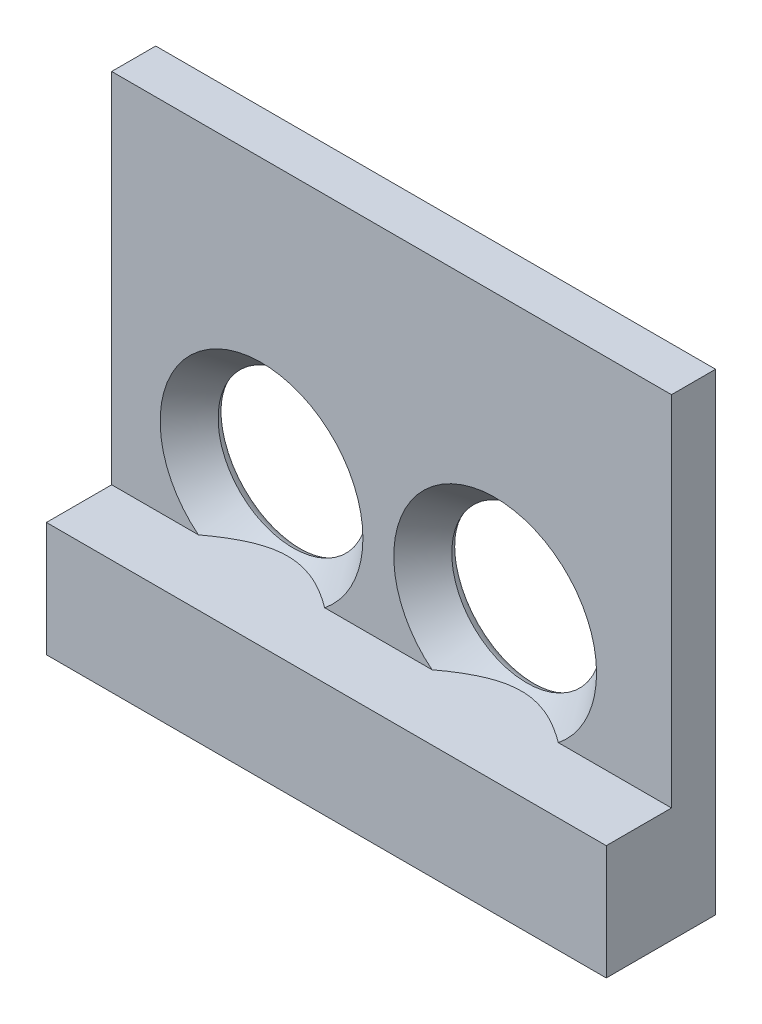
ISO-10303-21;
HEADER;
FILE_DESCRIPTION(('STEP AP214'),'2;1');
FILE_NAME('part.step','',(''),(''),'','','');
FILE_SCHEMA(('AUTOMOTIVE_DESIGN { 1 0 10303 214 1 1 1 1 }'));
ENDSEC;
DATA;
#1=APPLICATION_CONTEXT('core data for automotive mechanical design processes');
#2=APPLICATION_PROTOCOL_DEFINITION('international standard','automotive_design',2000,#1);
#3=PRODUCT_CONTEXT('',#1,'mechanical');
#4=PRODUCT('Part','Part','',(#3));
#5=PRODUCT_RELATED_PRODUCT_CATEGORY('part','',(#4));
#6=PRODUCT_DEFINITION_FORMATION('','',#4);
#7=PRODUCT_DEFINITION_CONTEXT('part definition',#1,'design');
#8=PRODUCT_DEFINITION('design','',#6,#7);
#9=PRODUCT_DEFINITION_SHAPE('','',#8);
#10=(LENGTH_UNIT() NAMED_UNIT(*) SI_UNIT(.MILLI.,.METRE.));
#11=(NAMED_UNIT(*) PLANE_ANGLE_UNIT() SI_UNIT($,.RADIAN.));
#12=(NAMED_UNIT(*) SI_UNIT($,.STERADIAN.) SOLID_ANGLE_UNIT());
#13=UNCERTAINTY_MEASURE_WITH_UNIT(LENGTH_MEASURE(1.E-05),#10,'distance_accuracy_value','');
#14=(GEOMETRIC_REPRESENTATION_CONTEXT(3) GLOBAL_UNCERTAINTY_ASSIGNED_CONTEXT((#13)) GLOBAL_UNIT_ASSIGNED_CONTEXT((#10,
#11,#12)) REPRESENTATION_CONTEXT('',''));
#15=CARTESIAN_POINT('',(0.,0.,0.));
#16=DIRECTION('',(0.,0.,1.));
#17=DIRECTION('',(1.,0.,0.));
#18=AXIS2_PLACEMENT_3D('',#15,#16,#17);
#19=CARTESIAN_POINT('',(-25.538243936064,62.13133386161,5.));
#20=DIRECTION('',(1.,0.,0.));
#21=DIRECTION('',(0.,0.,-1.));
#22=AXIS2_PLACEMENT_3D('',#19,#20,#21);
#23=PLANE('',#22);
#24=DIRECTION('',(0.,-1.,0.));
#25=VECTOR('',#24,1.);
#26=CARTESIAN_POINT('',(-25.538243936064,62.13133386161,0.));
#27=LINE('',#26,#25);
#28=CARTESIAN_POINT('',(-25.538243936064,62.13133386161,0.));
#29=VERTEX_POINT('',#28);
#30=CARTESIAN_POINT('',(-25.538243936064,8.53133386160998,0.));
#31=VERTEX_POINT('',#30);
#32=EDGE_CURVE('E112',#29,#31,#27,.T.);
#33=ORIENTED_EDGE('',*,*,#32,.T.);
#34=DIRECTION('',(0.,0.,-1.));
#35=VECTOR('',#34,1.);
#36=CARTESIAN_POINT('',(-25.538243936064,8.53133386160998,5.));
#37=LINE('',#36,#35);
#38=CARTESIAN_POINT('',(-25.538243936064,8.53133386160998,12.4));
#39=VERTEX_POINT('',#38);
#40=EDGE_CURVE('E105',#39,#31,#37,.T.);
#41=ORIENTED_EDGE('',*,*,#40,.F.);
#42=DIRECTION('',(0.,-1.,0.));
#43=VECTOR('',#42,1.);
#44=CARTESIAN_POINT('',(-25.538243936064,8.53133386160998,12.4));
#45=LINE('',#44,#43);
#46=CARTESIAN_POINT('',(-25.538243936064,21.53133386161,12.4));
#47=VERTEX_POINT('',#46);
#48=EDGE_CURVE('E109',#47,#39,#45,.T.);
#49=ORIENTED_EDGE('',*,*,#48,.F.);
#50=DIRECTION('',(0.,0.,-1.));
#51=VECTOR('',#50,1.);
#52=CARTESIAN_POINT('',(-25.538243936064,21.53133386161,12.4));
#53=LINE('',#52,#51);
#54=CARTESIAN_POINT('',(-25.538243936064,21.53133386161,5.));
#55=VERTEX_POINT('',#54);
#56=EDGE_CURVE('E143',#47,#55,#53,.T.);
#57=ORIENTED_EDGE('',*,*,#56,.T.);
#58=DIRECTION('',(0.,-1.,0.));
#59=VECTOR('',#58,1.);
#60=CARTESIAN_POINT('',(-25.538243936064,62.13133386161,5.));
#61=LINE('',#60,#59);
#62=CARTESIAN_POINT('',(-25.538243936064,62.13133386161,5.));
#63=VERTEX_POINT('',#62);
#64=EDGE_CURVE('E151',#63,#55,#61,.T.);
#65=ORIENTED_EDGE('',*,*,#64,.F.);
#66=DIRECTION('',(0.,0.,-1.));
#67=VECTOR('',#66,1.);
#68=CARTESIAN_POINT('',(-25.538243936064,62.13133386161,5.));
#69=LINE('',#68,#67);
#70=EDGE_CURVE('E162',#63,#29,#69,.T.);
#71=ORIENTED_EDGE('',*,*,#70,.T.);
#72=EDGE_LOOP('',(#33,#41,#49,#57,#65,#71));
#73=FACE_BOUND('',#72,.T.);
#74=ADVANCED_FACE('F39',(#73),#23,.F.);
#75=CARTESIAN_POINT('',(-25.538243936064,8.53133386160998,5.));
#76=DIRECTION('',(0.,1.,0.));
#77=DIRECTION('',(0.,0.,1.));
#78=AXIS2_PLACEMENT_3D('',#75,#76,#77);
#79=PLANE('',#78);
#80=DIRECTION('',(1.,0.,0.));
#81=VECTOR('',#80,1.);
#82=CARTESIAN_POINT('',(-25.538243936064,8.53133386160998,0.));
#83=LINE('',#82,#81);
#84=CARTESIAN_POINT('',(37.961756063936,8.53133386160998,0.));
#85=VERTEX_POINT('',#84);
#86=EDGE_CURVE('E165',#31,#85,#83,.T.);
#87=ORIENTED_EDGE('',*,*,#86,.T.);
#88=DIRECTION('',(0.,0.,-1.));
#89=VECTOR('',#88,1.);
#90=CARTESIAN_POINT('',(37.961756063936,8.53133386160998,5.));
#91=LINE('',#90,#89);
#92=CARTESIAN_POINT('',(37.961756063936,8.53133386160998,12.4));
#93=VERTEX_POINT('',#92);
#94=EDGE_CURVE('E116',#93,#85,#91,.T.);
#95=ORIENTED_EDGE('',*,*,#94,.F.);
#96=DIRECTION('',(1.,0.,0.));
#97=VECTOR('',#96,1.);
#98=CARTESIAN_POINT('',(-25.538243936064,8.53133386160998,12.4));
#99=LINE('',#98,#97);
#100=EDGE_CURVE('E119',#39,#93,#99,.T.);
#101=ORIENTED_EDGE('',*,*,#100,.F.);
#102=ORIENTED_EDGE('',*,*,#40,.T.);
#103=EDGE_LOOP('',(#87,#95,#101,#102));
#104=FACE_BOUND('',#103,.T.);
#105=ADVANCED_FACE('F120',(#104),#79,.F.);
#106=CARTESIAN_POINT('',(37.961756063936,62.13133386161,5.));
#107=DIRECTION('',(-1.,0.,0.));
#108=DIRECTION('',(0.,-1.,0.));
#109=AXIS2_PLACEMENT_3D('',#106,#107,#108);
#110=PLANE('',#109);
#111=DIRECTION('',(0.,1.,0.));
#112=VECTOR('',#111,1.);
#113=CARTESIAN_POINT('',(37.961756063936,62.13133386161,0.));
#114=LINE('',#113,#112);
#115=CARTESIAN_POINT('',(37.961756063936,62.13133386161,0.));
#116=VERTEX_POINT('',#115);
#117=EDGE_CURVE('E168',#85,#116,#114,.T.);
#118=ORIENTED_EDGE('',*,*,#117,.T.);
#119=DIRECTION('',(0.,0.,-1.));
#120=VECTOR('',#119,1.);
#121=CARTESIAN_POINT('',(37.961756063936,62.13133386161,5.));
#122=LINE('',#121,#120);
#123=CARTESIAN_POINT('',(37.961756063936,62.13133386161,5.));
#124=VERTEX_POINT('',#123);
#125=EDGE_CURVE('E175',#124,#116,#122,.T.);
#126=ORIENTED_EDGE('',*,*,#125,.F.);
#127=DIRECTION('',(0.,1.,0.));
#128=VECTOR('',#127,1.);
#129=CARTESIAN_POINT('',(37.961756063936,62.13133386161,5.));
#130=LINE('',#129,#128);
#131=CARTESIAN_POINT('',(37.961756063936,21.53133386161,5.));
#132=VERTEX_POINT('',#131);
#133=EDGE_CURVE('E155',#132,#124,#130,.T.);
#134=ORIENTED_EDGE('',*,*,#133,.F.);
#135=DIRECTION('',(0.,0.,-1.));
#136=VECTOR('',#135,1.);
#137=CARTESIAN_POINT('',(37.961756063936,21.53133386161,12.4));
#138=LINE('',#137,#136);
#139=CARTESIAN_POINT('',(37.961756063936,21.53133386161,12.4));
#140=VERTEX_POINT('',#139);
#141=EDGE_CURVE('E147',#140,#132,#138,.T.);
#142=ORIENTED_EDGE('',*,*,#141,.F.);
#143=DIRECTION('',(0.,1.,0.));
#144=VECTOR('',#143,1.);
#145=CARTESIAN_POINT('',(37.961756063936,8.53133386160998,12.4));
#146=LINE('',#145,#144);
#147=EDGE_CURVE('E125',#93,#140,#146,.T.);
#148=ORIENTED_EDGE('',*,*,#147,.F.);
#149=ORIENTED_EDGE('',*,*,#94,.T.);
#150=EDGE_LOOP('',(#118,#126,#134,#142,#148,#149));
#151=FACE_BOUND('',#150,.T.);
#152=ADVANCED_FACE('F235',(#151),#110,.F.);
#153=CARTESIAN_POINT('',(-25.538243936064,62.13133386161,5.));
#154=DIRECTION('',(0.,-1.,0.));
#155=DIRECTION('',(0.,0.,-1.));
#156=AXIS2_PLACEMENT_3D('',#153,#154,#155);
#157=PLANE('',#156);
#158=DIRECTION('',(-1.,0.,0.));
#159=VECTOR('',#158,1.);
#160=CARTESIAN_POINT('',(-25.538243936064,62.13133386161,0.));
#161=LINE('',#160,#159);
#162=EDGE_CURVE('E156',#116,#29,#161,.T.);
#163=ORIENTED_EDGE('',*,*,#162,.T.);
#164=ORIENTED_EDGE('',*,*,#70,.F.);
#165=DIRECTION('',(-1.,0.,0.));
#166=VECTOR('',#165,1.);
#167=CARTESIAN_POINT('',(-25.538243936064,62.13133386161,5.));
#168=LINE('',#167,#166);
#169=EDGE_CURVE('E159',#124,#63,#168,.T.);
#170=ORIENTED_EDGE('',*,*,#169,.F.);
#171=ORIENTED_EDGE('',*,*,#125,.T.);
#172=EDGE_LOOP('',(#163,#164,#170,#171));
#173=FACE_BOUND('',#172,.T.);
#174=ADVANCED_FACE('F239',(#173),#157,.F.);
#175=CARTESIAN_POINT('',(0.,0.,5.));
#176=DIRECTION('',(0.,0.,1.));
#177=DIRECTION('',(1.,0.,0.));
#178=AXIS2_PLACEMENT_3D('',#175,#176,#177);
#179=PLANE('',#178);
#180=DIRECTION('',(-1.,0.,0.));
#181=VECTOR('',#180,1.);
#182=CARTESIAN_POINT('',(-25.538243936064,21.53133386161,5.));
#183=LINE('',#182,#181);
#184=CARTESIAN_POINT('',(10.8028455322979,21.53133386161,5.));
#185=VERTEX_POINT('',#184);
#186=CARTESIAN_POINT('',(-1.37933340442584,21.53133386161,5.));
#187=VERTEX_POINT('',#186);
#188=EDGE_CURVE('E136',#185,#187,#183,.T.);
#189=ORIENTED_EDGE('',*,*,#188,.F.);
#190=CARTESIAN_POINT('',(17.961756063936,30.53133386161,5.));
#191=DIRECTION('',(0.,0.,1.));
#192=DIRECTION('',(1.,0.,0.));
#193=AXIS2_PLACEMENT_3D('',#190,#191,#192);
#194=CIRCLE('',#193,11.5);
#195=CARTESIAN_POINT('',(25.1206665955742,21.53133386161,5.));
#196=VERTEX_POINT('',#195);
#197=EDGE_CURVE('E187',#185,#196,#194,.F.);
#198=ORIENTED_EDGE('',*,*,#197,.T.);
#199=EDGE_CURVE('E132',#132,#196,#183,.T.);
#200=ORIENTED_EDGE('',*,*,#199,.F.);
#201=ORIENTED_EDGE('',*,*,#133,.T.);
#202=ORIENTED_EDGE('',*,*,#169,.T.);
#203=ORIENTED_EDGE('',*,*,#64,.T.);
#204=CARTESIAN_POINT('',(-15.6971544677021,21.53133386161,5.));
#205=VERTEX_POINT('',#204);
#206=EDGE_CURVE('E138',#205,#55,#183,.T.);
#207=ORIENTED_EDGE('',*,*,#206,.F.);
#208=CARTESIAN_POINT('',(-8.53824393606398,30.53133386161,5.));
#209=DIRECTION('',(0.,0.,1.));
#210=DIRECTION('',(1.,0.,0.));
#211=AXIS2_PLACEMENT_3D('',#208,#209,#210);
#212=CIRCLE('',#211,11.5);
#213=EDGE_CURVE('E184',#205,#187,#212,.F.);
#214=ORIENTED_EDGE('',*,*,#213,.T.);
#215=EDGE_LOOP('',(#189,#198,#200,#201,#202,#203,#207,#214));
#216=FACE_BOUND('',#215,.T.);
#217=ADVANCED_FACE('F245',(#216),#179,.T.);
#218=CARTESIAN_POINT('',(0.,0.,0.));
#219=DIRECTION('',(0.,0.,1.));
#220=DIRECTION('',(1.,0.,0.));
#221=AXIS2_PLACEMENT_3D('',#218,#219,#220);
#222=PLANE('',#221);
#223=CARTESIAN_POINT('',(17.961756063936,30.53133386161,0.));
#224=DIRECTION('',(0.,0.,1.));
#225=DIRECTION('',(1.,0.,0.));
#226=AXIS2_PLACEMENT_3D('',#223,#224,#225);
#227=CIRCLE('',#226,10.4154829776182);
#228=CARTESIAN_POINT('',(28.3772390415542,30.53133386161,0.));
#229=VERTEX_POINT('',#228);
#230=EDGE_CURVE('E11',#229,#229,#227,.T.);
#231=ORIENTED_EDGE('',*,*,#230,.T.);
#232=EDGE_LOOP('',(#231));
#233=FACE_BOUND('',#232,.T.);
#234=CARTESIAN_POINT('',(-8.53824393606398,30.53133386161,0.));
#235=DIRECTION('',(0.,0.,1.));
#236=DIRECTION('',(1.,0.,0.));
#237=AXIS2_PLACEMENT_3D('',#234,#235,#236);
#238=CIRCLE('',#237,10.4154829776182);
#239=CARTESIAN_POINT('',(1.87723904155418,30.53133386161,0.));
#240=VERTEX_POINT('',#239);
#241=EDGE_CURVE('E48',#240,#240,#238,.T.);
#242=ORIENTED_EDGE('',*,*,#241,.T.);
#243=EDGE_LOOP('',(#242));
#244=FACE_BOUND('',#243,.T.);
#245=ORIENTED_EDGE('',*,*,#32,.F.);
#246=ORIENTED_EDGE('',*,*,#162,.F.);
#247=ORIENTED_EDGE('',*,*,#117,.F.);
#248=ORIENTED_EDGE('',*,*,#86,.F.);
#249=EDGE_LOOP('',(#245,#246,#247,#248));
#250=FACE_BOUND('',#249,.T.);
#251=ADVANCED_FACE('F247',(#233,#244,#250),#222,.F.);
#252=CARTESIAN_POINT('',(-25.538243936064,21.53133386161,12.4));
#253=DIRECTION('',(0.,-1.,0.));
#254=DIRECTION('',(0.,0.,-1.));
#255=AXIS2_PLACEMENT_3D('',#252,#253,#254);
#256=PLANE('',#255);
#257=ORIENTED_EDGE('',*,*,#199,.T.);
#258=CARTESIAN_POINT('',(25.1206665955742,21.53133386161,5.));
#259=CARTESIAN_POINT('',(24.9707884558801,21.53133386161,4.88882127975553));
#260=CARTESIAN_POINT('',(24.8198922272615,21.53133386161,4.77899973271482));
#261=CARTESIAN_POINT('',(24.5158322500172,21.53133386161,4.56248165085394));
#262=CARTESIAN_POINT('',(24.3626680694144,21.53133386161,4.45578572320402));
#263=CARTESIAN_POINT('',(24.0533443449843,21.53133386161,4.24559620917078));
#264=CARTESIAN_POINT('',(23.8971760223859,21.53133386161,4.14211549307026));
#265=CARTESIAN_POINT('',(23.5821790242611,21.53133386161,3.93931180903068));
#266=CARTESIAN_POINT('',(23.4233504834086,21.53133386161,3.83998863150109));
#267=CARTESIAN_POINT('',(22.9340578747123,21.53133386161,3.54402112276973));
#268=CARTESIAN_POINT('',(22.5989121651274,21.53133386161,3.35498687561698));
#269=CARTESIAN_POINT('',(21.9150544007936,21.53133386161,3.00399323737214));
#270=CARTESIAN_POINT('',(21.5663626473338,21.53133386161,2.84199512123846));
#271=CARTESIAN_POINT('',(20.9907341205922,21.53133386161,2.60909470810025));
#272=CARTESIAN_POINT('',(20.7683057070496,21.53133386161,2.52706407307454));
#273=CARTESIAN_POINT('',(20.3180737567671,21.53133386161,2.37913042208977));
#274=CARTESIAN_POINT('',(20.0902700455131,21.53133386161,2.31322793053788));
#275=CARTESIAN_POINT('',(19.6320338257532,21.53133386161,2.20052151306516));
#276=CARTESIAN_POINT('',(19.4016413655192,21.53133386161,2.15355659410367));
#277=CARTESIAN_POINT('',(18.9376033787743,21.53133386161,2.08000196855281));
#278=CARTESIAN_POINT('',(18.7039581533172,21.53133386161,2.05341038894386));
#279=CARTESIAN_POINT('',(18.2329021818288,21.53133386161,2.02178853002527));
#280=CARTESIAN_POINT('',(17.9954769254906,21.53133386161,2.01697079455265));
#281=CARTESIAN_POINT('',(17.5212373597953,21.53133386161,2.0297387856078));
#282=CARTESIAN_POINT('',(17.2844230588214,21.53133386161,2.04732481793491));
#283=CARTESIAN_POINT('',(16.8126018653836,21.53133386161,2.10406203721945));
#284=CARTESIAN_POINT('',(16.5776039587433,21.53133386161,2.14328698773307));
#285=CARTESIAN_POINT('',(16.1117941176042,21.53133386161,2.24144865585203));
#286=CARTESIAN_POINT('',(15.8809828306012,21.53133386161,2.30038839556826));
#287=CARTESIAN_POINT('',(15.3266765699851,21.53133386161,2.46455331966611));
#288=CARTESIAN_POINT('',(15.0058537080853,21.53133386161,2.57878946549646));
#289=CARTESIAN_POINT('',(14.3756402256905,21.53133386161,2.83530841571852));
#290=CARTESIAN_POINT('',(14.0662576454559,21.53133386161,2.9776105162022));
#291=CARTESIAN_POINT('',(13.4576787997359,21.53133386161,3.28428151306857));
#292=CARTESIAN_POINT('',(13.1585133850745,21.53133386161,3.44871090872444));
#293=CARTESIAN_POINT('',(12.5701940134251,21.53133386161,3.7942466907046));
#294=CARTESIAN_POINT('',(12.2810370015767,21.53133386161,3.97534792541007));
#295=CARTESIAN_POINT('',(11.7926508790697,21.53133386161,4.29691977837478));
#296=CARTESIAN_POINT('',(11.5913176469096,21.53133386161,4.43422796733436));
#297=CARTESIAN_POINT('',(11.1937176586034,21.53133386161,4.71362396914593));
#298=CARTESIAN_POINT('',(10.9974284137376,21.53133386161,4.8556797292035));
#299=CARTESIAN_POINT('',(10.8028455322979,21.53133386161,5.));
#300=B_SPLINE_CURVE_WITH_KNOTS('',3,(#258,#259,#260,#261,#262,#263,#264,#265,#266,#267,#268,
#269,#270,#271,#272,#273,#274,#275,#276,#277,#278,#279,#280,#281,#282,#283,#284,#285,#286,#287,
#288,#289,#290,#291,#292,#293,#294,#295,#296,#297,#298,#299),.UNSPECIFIED.,.F.,.F.,(4,2,2,2,2,2,
2,2,2,2,2,2,2,2,2,2,2,2,2,2,4),(0.,0.559842224133377,1.1197924893571,1.68175280245573,
2.24368475171273,3.3971241235555,4.54889692408191,5.25960991303315,5.97034600777405,
6.67490567899228,7.37940056885867,8.09075768861675,8.80212451811973,9.51593140132147,
10.2298477552821,11.2497267797404,12.270309458024,13.2937415101402,14.3168583752408,
15.0478613051424,15.774657496133),.UNSPECIFIED.);
#301=EDGE_CURVE('E195',#196,#185,#300,.T.);
#302=ORIENTED_EDGE('',*,*,#301,.T.);
#303=ORIENTED_EDGE('',*,*,#188,.T.);
#304=CARTESIAN_POINT('',(-1.37933340442584,21.53133386161,5.));
#305=CARTESIAN_POINT('',(-1.52921154411988,21.53133386161,4.88882127975553));
#306=CARTESIAN_POINT('',(-1.68010777273856,21.53133386161,4.77899973271482));
#307=CARTESIAN_POINT('',(-1.9841677499828,21.53133386161,4.56248165085394));
#308=CARTESIAN_POINT('',(-2.1373319305856,21.53133386161,4.45578572320402));
#309=CARTESIAN_POINT('',(-2.44665565501574,21.53133386161,4.24559620917078));
#310=CARTESIAN_POINT('',(-2.60282397761415,21.53133386161,4.14211549307026));
#311=CARTESIAN_POINT('',(-2.91782097573896,21.53133386161,3.93931180903068));
#312=CARTESIAN_POINT('',(-3.07664951659144,21.53133386161,3.83998863150109));
#313=CARTESIAN_POINT('',(-3.56594212528774,21.53133386161,3.54402112276973));
#314=CARTESIAN_POINT('',(-3.90108783487262,21.53133386161,3.35498687561698));
#315=CARTESIAN_POINT('',(-4.58494559920644,21.53133386161,3.00399323737214));
#316=CARTESIAN_POINT('',(-4.93363735266627,21.53133386161,2.84199512123846));
#317=CARTESIAN_POINT('',(-5.50926587940786,21.53133386161,2.60909470810025));
#318=CARTESIAN_POINT('',(-5.73169429295037,21.53133386161,2.52706407307454));
#319=CARTESIAN_POINT('',(-6.18192624323292,21.53133386161,2.37913042208977));
#320=CARTESIAN_POINT('',(-6.40972995448697,21.53133386161,2.31322793053788));
#321=CARTESIAN_POINT('',(-6.86796617424684,21.53133386161,2.20052151306516));
#322=CARTESIAN_POINT('',(-7.09835863448081,21.53133386161,2.15355659410367));
#323=CARTESIAN_POINT('',(-7.5623966212257,21.53133386161,2.08000196855281));
#324=CARTESIAN_POINT('',(-7.79604184668286,21.53133386161,2.05341038894386));
#325=CARTESIAN_POINT('',(-8.26709781817126,21.53133386161,2.02178853002527));
#326=CARTESIAN_POINT('',(-8.50452307450937,21.53133386161,2.01697079455265));
#327=CARTESIAN_POINT('',(-8.97876264020474,21.53133386161,2.0297387856078));
#328=CARTESIAN_POINT('',(-9.21557694117857,21.53133386161,2.04732481793491));
#329=CARTESIAN_POINT('',(-9.68739813461639,21.53133386161,2.10406203721945));
#330=CARTESIAN_POINT('',(-9.92239604125673,21.53133386161,2.14328698773307));
#331=CARTESIAN_POINT('',(-10.3882058823958,21.53133386161,2.24144865585203));
#332=CARTESIAN_POINT('',(-10.6190171693988,21.53133386161,2.30038839556826));
#333=CARTESIAN_POINT('',(-11.173323430015,21.53133386161,2.46455331966611));
#334=CARTESIAN_POINT('',(-11.4941462919148,21.53133386161,2.57878946549646));
#335=CARTESIAN_POINT('',(-12.1243597743095,21.53133386161,2.83530841571852));
#336=CARTESIAN_POINT('',(-12.4337423545442,21.53133386161,2.9776105162022));
#337=CARTESIAN_POINT('',(-13.0423212002642,21.53133386161,3.28428151306857));
#338=CARTESIAN_POINT('',(-13.3414866149255,21.53133386161,3.44871090872444));
#339=CARTESIAN_POINT('',(-13.9298059865749,21.53133386161,3.7942466907046));
#340=CARTESIAN_POINT('',(-14.2189629984233,21.53133386161,3.97534792541007));
#341=CARTESIAN_POINT('',(-14.7073491209303,21.53133386161,4.29691977837478));
#342=CARTESIAN_POINT('',(-14.9086823530905,21.53133386161,4.43422796733436));
#343=CARTESIAN_POINT('',(-15.3062823413966,21.53133386161,4.71362396914593));
#344=CARTESIAN_POINT('',(-15.5025715862624,21.53133386161,4.85567972920351));
#345=CARTESIAN_POINT('',(-15.6971544677021,21.53133386161,5.));
#346=B_SPLINE_CURVE_WITH_KNOTS('',3,(#304,#305,#306,#307,#308,#309,#310,#311,#312,#313,#314,
#315,#316,#317,#318,#319,#320,#321,#322,#323,#324,#325,#326,#327,#328,#329,#330,#331,#332,#333,
#334,#335,#336,#337,#338,#339,#340,#341,#342,#343,#344,#345),.UNSPECIFIED.,.F.,.F.,(4,2,2,2,2,2,
2,2,2,2,2,2,2,2,2,2,2,2,2,2,4),(0.,0.559842224133377,1.1197924893571,1.68175280245573,
2.24368475171272,3.39712412355549,4.5488969240819,5.25960991303315,5.97034600777405,
6.67490567899227,7.37940056885867,8.09075768861675,8.80212451811973,9.51593140132146,
10.2298477552821,11.2497267797404,12.270309458024,13.2937415101402,14.3168583752408,
15.0478613051424,15.774657496133),.UNSPECIFIED.);
#347=EDGE_CURVE('E55',#187,#205,#346,.T.);
#348=ORIENTED_EDGE('',*,*,#347,.T.);
#349=ORIENTED_EDGE('',*,*,#206,.T.);
#350=ORIENTED_EDGE('',*,*,#56,.F.);
#351=DIRECTION('',(-1.,0.,0.));
#352=VECTOR('',#351,1.);
#353=CARTESIAN_POINT('',(-25.538243936064,21.53133386161,12.4));
#354=LINE('',#353,#352);
#355=EDGE_CURVE('E129',#140,#47,#354,.T.);
#356=ORIENTED_EDGE('',*,*,#355,.F.);
#357=ORIENTED_EDGE('',*,*,#141,.T.);
#358=EDGE_LOOP('',(#257,#302,#303,#348,#349,#350,#356,#357));
#359=FACE_BOUND('',#358,.T.);
#360=ADVANCED_FACE('F209',(#359),#256,.F.);
#361=CARTESIAN_POINT('',(0.,0.,12.4));
#362=DIRECTION('',(0.,0.,-1.));
#363=DIRECTION('',(-1.,0.,0.));
#364=AXIS2_PLACEMENT_3D('',#361,#362,#363);
#365=PLANE('',#364);
#366=ORIENTED_EDGE('',*,*,#48,.T.);
#367=ORIENTED_EDGE('',*,*,#100,.T.);
#368=ORIENTED_EDGE('',*,*,#147,.T.);
#369=ORIENTED_EDGE('',*,*,#355,.T.);
#370=EDGE_LOOP('',(#366,#367,#368,#369));
#371=FACE_BOUND('',#370,.T.);
#372=ADVANCED_FACE('F127',(#371),#365,.F.);
#373=CARTESIAN_POINT('',(17.961756063936,30.53133386161,1.42473922221738));
#374=DIRECTION('',(0.,0.,1.));
#375=DIRECTION('',(1.,0.,0.));
#376=AXIS2_PLACEMENT_3D('',#373,#374,#375);
#377=CONICAL_SURFACE('',#376,8.49999999999999,0.698131700797731);
#378=ORIENTED_EDGE('',*,*,#301,.F.);
#379=ORIENTED_EDGE('',*,*,#197,.F.);
#380=EDGE_LOOP('',(#378,#379));
#381=FACE_BOUND('',#380,.T.);
#382=CARTESIAN_POINT('',(17.961756063936,30.53133386161,1.42473922221738));
#383=DIRECTION('',(0.,0.,1.));
#384=DIRECTION('',(1.,0.,0.));
#385=AXIS2_PLACEMENT_3D('',#382,#383,#384);
#386=CIRCLE('',#385,8.49999999999999);
#387=CARTESIAN_POINT('',(26.461756063936,30.53133386161,1.42473922221738));
#388=VERTEX_POINT('',#387);
#389=EDGE_CURVE('E115',#388,#388,#386,.T.);
#390=ORIENTED_EDGE('',*,*,#389,.F.);
#391=EDGE_LOOP('',(#390));
#392=FACE_BOUND('',#391,.T.);
#393=ADVANCED_FACE('F213',(#381,#392),#377,.F.);
#394=CARTESIAN_POINT('',(-8.53824393606398,30.53133386161,1.42473922221738));
#395=DIRECTION('',(0.,0.,1.));
#396=DIRECTION('',(1.,0.,0.));
#397=AXIS2_PLACEMENT_3D('',#394,#395,#396);
#398=CONICAL_SURFACE('',#397,8.49999999999999,0.698131700797731);
#399=ORIENTED_EDGE('',*,*,#347,.F.);
#400=ORIENTED_EDGE('',*,*,#213,.F.);
#401=EDGE_LOOP('',(#399,#400));
#402=FACE_BOUND('',#401,.T.);
#403=CARTESIAN_POINT('',(-8.53824393606398,30.53133386161,1.42473922221738));
#404=DIRECTION('',(0.,0.,1.));
#405=DIRECTION('',(1.,0.,0.));
#406=AXIS2_PLACEMENT_3D('',#403,#404,#405);
#407=CIRCLE('',#406,8.49999999999999);
#408=CARTESIAN_POINT('',(-0.0382439360639853,30.53133386161,1.42473922221738));
#409=VERTEX_POINT('',#408);
#410=EDGE_CURVE('E191',#409,#409,#407,.T.);
#411=ORIENTED_EDGE('',*,*,#410,.F.);
#412=EDGE_LOOP('',(#411));
#413=FACE_BOUND('',#412,.T.);
#414=ADVANCED_FACE('F217',(#402,#413),#398,.F.);
#415=CARTESIAN_POINT('',(17.961756063936,30.53133386161,2.));
#416=DIRECTION('',(0.,0.,1.));
#417=DIRECTION('',(1.,0.,0.));
#418=AXIS2_PLACEMENT_3D('',#415,#416,#417);
#419=TOROIDAL_SURFACE('',#418,10.4154829776182,2.);
#420=ORIENTED_EDGE('',*,*,#230,.F.);
#421=EDGE_LOOP('',(#420));
#422=FACE_BOUND('',#421,.T.);
#423=ORIENTED_EDGE('',*,*,#389,.T.);
#424=EDGE_LOOP('',(#423));
#425=FACE_BOUND('',#424,.T.);
#426=ADVANCED_FACE('F222',(#422,#425),#419,.T.);
#427=CARTESIAN_POINT('',(-8.53824393606398,30.53133386161,2.));
#428=DIRECTION('',(0.,0.,1.));
#429=DIRECTION('',(1.,0.,0.));
#430=AXIS2_PLACEMENT_3D('',#427,#428,#429);
#431=TOROIDAL_SURFACE('',#430,10.4154829776182,2.);
#432=ORIENTED_EDGE('',*,*,#241,.F.);
#433=EDGE_LOOP('',(#432));
#434=FACE_BOUND('',#433,.T.);
#435=ORIENTED_EDGE('',*,*,#410,.T.);
#436=EDGE_LOOP('',(#435));
#437=FACE_BOUND('',#436,.T.);
#438=ADVANCED_FACE('F41',(#434,#437),#431,.T.);
#439=CLOSED_SHELL('',(#74,#105,#152,#174,#217,#251,#360,#372,#393,#414,#426,#438));
#440=MANIFOLD_SOLID_BREP('B2',#439);
#441=ADVANCED_BREP_SHAPE_REPRESENTATION('',(#18,#440),#14);
#442=SHAPE_DEFINITION_REPRESENTATION(#9,#441);
ENDSEC;
END-ISO-10303-21;
